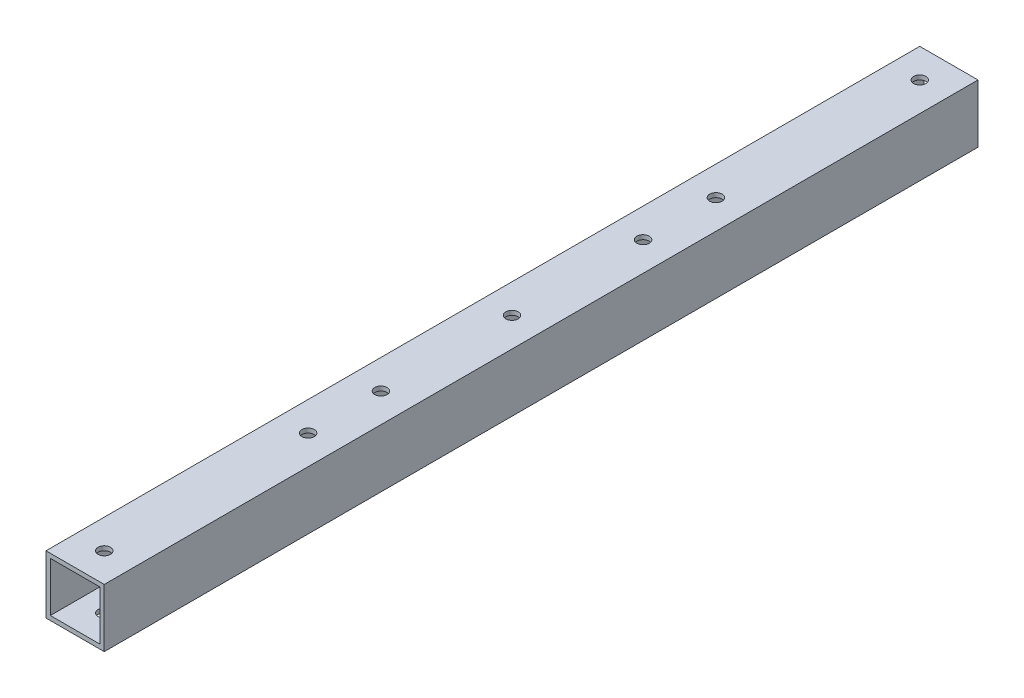
ISO-10303-21;
HEADER;
FILE_DESCRIPTION(('STEP AP214'),'2;1');
FILE_NAME('part.step','',(''),(''),'','','');
FILE_SCHEMA(('AUTOMOTIVE_DESIGN { 1 0 10303 214 1 1 1 1 }'));
ENDSEC;
DATA;
#1=APPLICATION_CONTEXT('core data for automotive mechanical design processes');
#2=APPLICATION_PROTOCOL_DEFINITION('international standard','automotive_design',2000,#1);
#3=PRODUCT_CONTEXT('',#1,'mechanical');
#4=PRODUCT('Part','Part','',(#3));
#5=PRODUCT_RELATED_PRODUCT_CATEGORY('part','',(#4));
#6=PRODUCT_DEFINITION_FORMATION('','',#4);
#7=PRODUCT_DEFINITION_CONTEXT('part definition',#1,'design');
#8=PRODUCT_DEFINITION('design','',#6,#7);
#9=PRODUCT_DEFINITION_SHAPE('','',#8);
#10=(LENGTH_UNIT() NAMED_UNIT(*) SI_UNIT(.MILLI.,.METRE.));
#11=(NAMED_UNIT(*) PLANE_ANGLE_UNIT() SI_UNIT($,.RADIAN.));
#12=(NAMED_UNIT(*) SI_UNIT($,.STERADIAN.) SOLID_ANGLE_UNIT());
#13=UNCERTAINTY_MEASURE_WITH_UNIT(LENGTH_MEASURE(1.E-05),#10,'distance_accuracy_value','');
#14=(GEOMETRIC_REPRESENTATION_CONTEXT(3) GLOBAL_UNCERTAINTY_ASSIGNED_CONTEXT((#13)) GLOBAL_UNIT_ASSIGNED_CONTEXT((#10,
#11,#12)) REPRESENTATION_CONTEXT('',''));
#15=CARTESIAN_POINT('',(0.,0.,0.));
#16=DIRECTION('',(0.,0.,1.));
#17=DIRECTION('',(1.,0.,0.));
#18=AXIS2_PLACEMENT_3D('',#15,#16,#17);
#19=CARTESIAN_POINT('',(10.,-9.99999999999999,-300.));
#20=DIRECTION('',(1.,0.,0.));
#21=DIRECTION('',(0.,0.,-1.));
#22=AXIS2_PLACEMENT_3D('',#19,#20,#21);
#23=PLANE('',#22);
#24=DIRECTION('',(0.,1.,0.));
#25=VECTOR('',#24,1.);
#26=CARTESIAN_POINT('',(10.,-9.99999999999999,0.));
#27=LINE('',#26,#25);
#28=CARTESIAN_POINT('',(10.,-9.99999999999999,0.));
#29=VERTEX_POINT('',#28);
#30=CARTESIAN_POINT('',(10.,10.,0.));
#31=VERTEX_POINT('',#30);
#32=EDGE_CURVE('E142',#29,#31,#27,.T.);
#33=ORIENTED_EDGE('',*,*,#32,.F.);
#34=DIRECTION('',(0.,0.,1.));
#35=VECTOR('',#34,1.);
#36=CARTESIAN_POINT('',(10.,-9.99999999999999,-300.));
#37=LINE('',#36,#35);
#38=CARTESIAN_POINT('',(10.,-9.99999999999999,-300.));
#39=VERTEX_POINT('',#38);
#40=EDGE_CURVE('E11',#39,#29,#37,.T.);
#41=ORIENTED_EDGE('',*,*,#40,.F.);
#42=DIRECTION('',(0.,1.,0.));
#43=VECTOR('',#42,1.);
#44=CARTESIAN_POINT('',(10.,-9.99999999999999,-300.));
#45=LINE('',#44,#43);
#46=CARTESIAN_POINT('',(10.,10.,-300.));
#47=VERTEX_POINT('',#46);
#48=EDGE_CURVE('E146',#39,#47,#45,.T.);
#49=ORIENTED_EDGE('',*,*,#48,.T.);
#50=DIRECTION('',(0.,0.,1.));
#51=VECTOR('',#50,1.);
#52=CARTESIAN_POINT('',(10.,10.,-300.));
#53=LINE('',#52,#51);
#54=EDGE_CURVE('E159',#47,#31,#53,.T.);
#55=ORIENTED_EDGE('',*,*,#54,.T.);
#56=EDGE_LOOP('',(#33,#41,#49,#55));
#57=FACE_BOUND('',#56,.T.);
#58=ADVANCED_FACE('F41',(#57),#23,.T.);
#59=CARTESIAN_POINT('',(-9.99999999999998,-9.99999999999999,-300.));
#60=DIRECTION('',(0.,-1.,0.));
#61=DIRECTION('',(0.,0.,-1.));
#62=AXIS2_PLACEMENT_3D('',#59,#60,#61);
#63=PLANE('',#62);
#64=CARTESIAN_POINT('',(0.,-9.99999999999999,-10.));
#65=DIRECTION('',(0.,1.,0.));
#66=DIRECTION('',(0.,0.,1.));
#67=AXIS2_PLACEMENT_3D('',#64,#65,#66);
#68=CIRCLE('',#67,2.125);
#69=CARTESIAN_POINT('',(0.,-9.99999999999999,-7.875));
#70=VERTEX_POINT('',#69);
#71=EDGE_CURVE('E178',#70,#70,#68,.T.);
#72=ORIENTED_EDGE('',*,*,#71,.T.);
#73=EDGE_LOOP('',(#72));
#74=FACE_BOUND('',#73,.T.);
#75=CARTESIAN_POINT('',(-7.20352289766011E-13,-9.99999999999999,-105.));
#76=DIRECTION('',(0.,1.,0.));
#77=DIRECTION('',(0.,0.,-1.));
#78=AXIS2_PLACEMENT_3D('',#75,#76,#77);
#79=CIRCLE('',#78,2.125);
#80=CARTESIAN_POINT('',(-7.20352289766011E-13,-9.99999999999999,-107.125));
#81=VERTEX_POINT('',#80);
#82=EDGE_CURVE('E239',#81,#81,#79,.T.);
#83=ORIENTED_EDGE('',*,*,#82,.T.);
#84=EDGE_LOOP('',(#83));
#85=FACE_BOUND('',#84,.T.);
#86=CARTESIAN_POINT('',(-7.20352289766011E-13,-9.99999999999999,-195.));
#87=DIRECTION('',(0.,1.,0.));
#88=DIRECTION('',(0.,0.,1.));
#89=AXIS2_PLACEMENT_3D('',#86,#87,#88);
#90=CIRCLE('',#89,2.125);
#91=CARTESIAN_POINT('',(-7.20352289766011E-13,-9.99999999999999,-192.875));
#92=VERTEX_POINT('',#91);
#93=EDGE_CURVE('E245',#92,#92,#90,.T.);
#94=ORIENTED_EDGE('',*,*,#93,.T.);
#95=EDGE_LOOP('',(#94));
#96=FACE_BOUND('',#95,.T.);
#97=CARTESIAN_POINT('',(-9.60469719688015E-13,-9.99999999999999,-290.));
#98=DIRECTION('',(0.,1.,0.));
#99=DIRECTION('',(0.,0.,1.));
#100=AXIS2_PLACEMENT_3D('',#97,#98,#99);
#101=CIRCLE('',#100,2.12499999999999);
#102=CARTESIAN_POINT('',(-9.60469719688015E-13,-9.99999999999999,-287.875));
#103=VERTEX_POINT('',#102);
#104=EDGE_CURVE('E213',#103,#103,#101,.T.);
#105=ORIENTED_EDGE('',*,*,#104,.T.);
#106=EDGE_LOOP('',(#105));
#107=FACE_BOUND('',#106,.T.);
#108=CARTESIAN_POINT('',(-7.20352289766011E-13,-9.99999999999999,-220.));
#109=DIRECTION('',(0.,1.,0.));
#110=DIRECTION('',(0.,0.,1.));
#111=AXIS2_PLACEMENT_3D('',#108,#109,#110);
#112=CIRCLE('',#111,2.125);
#113=CARTESIAN_POINT('',(-7.20352289766011E-13,-9.99999999999999,-217.875));
#114=VERTEX_POINT('',#113);
#115=EDGE_CURVE('E220',#114,#114,#112,.T.);
#116=ORIENTED_EDGE('',*,*,#115,.T.);
#117=EDGE_LOOP('',(#116));
#118=FACE_BOUND('',#117,.T.);
#119=CARTESIAN_POINT('',(-4.80234859844007E-13,-9.99999999999999,-150.));
#120=DIRECTION('',(0.,1.,0.));
#121=DIRECTION('',(0.,0.,1.));
#122=AXIS2_PLACEMENT_3D('',#119,#120,#121);
#123=CIRCLE('',#122,2.125);
#124=CARTESIAN_POINT('',(-4.80234859844007E-13,-9.99999999999999,-147.875));
#125=VERTEX_POINT('',#124);
#126=EDGE_CURVE('E226',#125,#125,#123,.T.);
#127=ORIENTED_EDGE('',*,*,#126,.T.);
#128=EDGE_LOOP('',(#127));
#129=FACE_BOUND('',#128,.T.);
#130=CARTESIAN_POINT('',(-2.40117429922004E-13,-9.99999999999999,-80.));
#131=DIRECTION('',(0.,1.,0.));
#132=DIRECTION('',(0.,0.,1.));
#133=AXIS2_PLACEMENT_3D('',#130,#131,#132);
#134=CIRCLE('',#133,2.125);
#135=CARTESIAN_POINT('',(-2.40117429922004E-13,-9.99999999999999,-77.875));
#136=VERTEX_POINT('',#135);
#137=EDGE_CURVE('E232',#136,#136,#134,.T.);
#138=ORIENTED_EDGE('',*,*,#137,.T.);
#139=EDGE_LOOP('',(#138));
#140=FACE_BOUND('',#139,.T.);
#141=DIRECTION('',(1.,0.,0.));
#142=VECTOR('',#141,1.);
#143=CARTESIAN_POINT('',(-9.99999999999998,-9.99999999999999,0.));
#144=LINE('',#143,#142);
#145=CARTESIAN_POINT('',(-9.99999999999998,-9.99999999999999,0.));
#146=VERTEX_POINT('',#145);
#147=EDGE_CURVE('E150',#146,#29,#144,.T.);
#148=ORIENTED_EDGE('',*,*,#147,.F.);
#149=DIRECTION('',(0.,0.,1.));
#150=VECTOR('',#149,1.);
#151=CARTESIAN_POINT('',(-9.99999999999998,-9.99999999999999,-300.));
#152=LINE('',#151,#150);
#153=CARTESIAN_POINT('',(-9.99999999999998,-9.99999999999999,-300.));
#154=VERTEX_POINT('',#153);
#155=EDGE_CURVE('E49',#154,#146,#152,.T.);
#156=ORIENTED_EDGE('',*,*,#155,.F.);
#157=DIRECTION('',(1.,0.,0.));
#158=VECTOR('',#157,1.);
#159=CARTESIAN_POINT('',(-9.99999999999998,-9.99999999999999,-300.));
#160=LINE('',#159,#158);
#161=EDGE_CURVE('E156',#154,#39,#160,.T.);
#162=ORIENTED_EDGE('',*,*,#161,.T.);
#163=ORIENTED_EDGE('',*,*,#40,.T.);
#164=EDGE_LOOP('',(#148,#156,#162,#163));
#165=FACE_BOUND('',#164,.T.);
#166=ADVANCED_FACE('F255',(#74,#85,#96,#107,#118,#129,#140,#165),#63,.T.);
#167=CARTESIAN_POINT('',(-9.99999999999998,-9.99999999999999,-300.));
#168=DIRECTION('',(-1.,0.,0.));
#169=DIRECTION('',(0.,0.,1.));
#170=AXIS2_PLACEMENT_3D('',#167,#168,#169);
#171=PLANE('',#170);
#172=DIRECTION('',(0.,-1.,0.));
#173=VECTOR('',#172,1.);
#174=CARTESIAN_POINT('',(-9.99999999999998,-9.99999999999999,0.));
#175=LINE('',#174,#173);
#176=CARTESIAN_POINT('',(-9.99999999999998,10.,0.));
#177=VERTEX_POINT('',#176);
#178=EDGE_CURVE('E165',#177,#146,#175,.T.);
#179=ORIENTED_EDGE('',*,*,#178,.F.);
#180=DIRECTION('',(0.,0.,1.));
#181=VECTOR('',#180,1.);
#182=CARTESIAN_POINT('',(-9.99999999999998,10.,-300.));
#183=LINE('',#182,#181);
#184=CARTESIAN_POINT('',(-9.99999999999998,10.,-300.));
#185=VERTEX_POINT('',#184);
#186=EDGE_CURVE('E171',#185,#177,#183,.T.);
#187=ORIENTED_EDGE('',*,*,#186,.F.);
#188=DIRECTION('',(0.,-1.,0.));
#189=VECTOR('',#188,1.);
#190=CARTESIAN_POINT('',(-9.99999999999998,-9.99999999999999,-300.));
#191=LINE('',#190,#189);
#192=EDGE_CURVE('E153',#185,#154,#191,.T.);
#193=ORIENTED_EDGE('',*,*,#192,.T.);
#194=ORIENTED_EDGE('',*,*,#155,.T.);
#195=EDGE_LOOP('',(#179,#187,#193,#194));
#196=FACE_BOUND('',#195,.T.);
#197=ADVANCED_FACE('F290',(#196),#171,.T.);
#198=CARTESIAN_POINT('',(-9.99999999999998,10.,-300.));
#199=DIRECTION('',(0.,1.,0.));
#200=DIRECTION('',(0.,0.,1.));
#201=AXIS2_PLACEMENT_3D('',#198,#199,#200);
#202=PLANE('',#201);
#203=CARTESIAN_POINT('',(0.,10.,-10.));
#204=DIRECTION('',(0.,1.,0.));
#205=DIRECTION('',(0.,0.,1.));
#206=AXIS2_PLACEMENT_3D('',#203,#204,#205);
#207=CIRCLE('',#206,2.125);
#208=CARTESIAN_POINT('',(0.,10.,-7.875));
#209=VERTEX_POINT('',#208);
#210=EDGE_CURVE('E238',#209,#209,#207,.T.);
#211=ORIENTED_EDGE('',*,*,#210,.F.);
#212=EDGE_LOOP('',(#211));
#213=FACE_BOUND('',#212,.T.);
#214=CARTESIAN_POINT('',(-7.20352289766011E-13,10.,-105.));
#215=DIRECTION('',(0.,1.,0.));
#216=DIRECTION('',(0.,0.,-1.));
#217=AXIS2_PLACEMENT_3D('',#214,#215,#216);
#218=CIRCLE('',#217,2.125);
#219=CARTESIAN_POINT('',(-7.20352289766011E-13,10.,-107.125));
#220=VERTEX_POINT('',#219);
#221=EDGE_CURVE('E242',#220,#220,#218,.T.);
#222=ORIENTED_EDGE('',*,*,#221,.F.);
#223=EDGE_LOOP('',(#222));
#224=FACE_BOUND('',#223,.T.);
#225=CARTESIAN_POINT('',(-7.20352289766011E-13,10.,-195.));
#226=DIRECTION('',(0.,1.,0.));
#227=DIRECTION('',(0.,0.,1.));
#228=AXIS2_PLACEMENT_3D('',#225,#226,#227);
#229=CIRCLE('',#228,2.125);
#230=CARTESIAN_POINT('',(-7.20352289766011E-13,10.,-192.875));
#231=VERTEX_POINT('',#230);
#232=EDGE_CURVE('E217',#231,#231,#229,.T.);
#233=ORIENTED_EDGE('',*,*,#232,.F.);
#234=EDGE_LOOP('',(#233));
#235=FACE_BOUND('',#234,.T.);
#236=CARTESIAN_POINT('',(-9.60469719688015E-13,10.,-290.));
#237=DIRECTION('',(0.,1.,0.));
#238=DIRECTION('',(0.,0.,1.));
#239=AXIS2_PLACEMENT_3D('',#236,#237,#238);
#240=CIRCLE('',#239,2.12499999999999);
#241=CARTESIAN_POINT('',(-9.60469719688015E-13,10.,-287.875));
#242=VERTEX_POINT('',#241);
#243=EDGE_CURVE('E216',#242,#242,#240,.T.);
#244=ORIENTED_EDGE('',*,*,#243,.F.);
#245=EDGE_LOOP('',(#244));
#246=FACE_BOUND('',#245,.T.);
#247=CARTESIAN_POINT('',(-7.20352289766011E-13,10.,-220.));
#248=DIRECTION('',(0.,1.,0.));
#249=DIRECTION('',(0.,0.,1.));
#250=AXIS2_PLACEMENT_3D('',#247,#248,#249);
#251=CIRCLE('',#250,2.125);
#252=CARTESIAN_POINT('',(-7.20352289766011E-13,10.,-217.875));
#253=VERTEX_POINT('',#252);
#254=EDGE_CURVE('E223',#253,#253,#251,.T.);
#255=ORIENTED_EDGE('',*,*,#254,.F.);
#256=EDGE_LOOP('',(#255));
#257=FACE_BOUND('',#256,.T.);
#258=CARTESIAN_POINT('',(-4.80234859844007E-13,10.,-150.));
#259=DIRECTION('',(0.,1.,0.));
#260=DIRECTION('',(0.,0.,1.));
#261=AXIS2_PLACEMENT_3D('',#258,#259,#260);
#262=CIRCLE('',#261,2.125);
#263=CARTESIAN_POINT('',(-4.80234859844007E-13,10.,-147.875));
#264=VERTEX_POINT('',#263);
#265=EDGE_CURVE('E229',#264,#264,#262,.T.);
#266=ORIENTED_EDGE('',*,*,#265,.F.);
#267=EDGE_LOOP('',(#266));
#268=FACE_BOUND('',#267,.T.);
#269=CARTESIAN_POINT('',(-2.40117429922004E-13,10.,-80.));
#270=DIRECTION('',(0.,1.,0.));
#271=DIRECTION('',(0.,0.,1.));
#272=AXIS2_PLACEMENT_3D('',#269,#270,#271);
#273=CIRCLE('',#272,2.125);
#274=CARTESIAN_POINT('',(-2.40117429922004E-13,10.,-77.875));
#275=VERTEX_POINT('',#274);
#276=EDGE_CURVE('E235',#275,#275,#273,.T.);
#277=ORIENTED_EDGE('',*,*,#276,.F.);
#278=EDGE_LOOP('',(#277));
#279=FACE_BOUND('',#278,.T.);
#280=DIRECTION('',(-1.,0.,0.));
#281=VECTOR('',#280,1.);
#282=CARTESIAN_POINT('',(-9.99999999999998,10.,0.));
#283=LINE('',#282,#281);
#284=EDGE_CURVE('E162',#31,#177,#283,.T.);
#285=ORIENTED_EDGE('',*,*,#284,.F.);
#286=ORIENTED_EDGE('',*,*,#54,.F.);
#287=DIRECTION('',(-1.,0.,0.));
#288=VECTOR('',#287,1.);
#289=CARTESIAN_POINT('',(-9.99999999999998,10.,-300.));
#290=LINE('',#289,#288);
#291=EDGE_CURVE('E149',#47,#185,#290,.T.);
#292=ORIENTED_EDGE('',*,*,#291,.T.);
#293=ORIENTED_EDGE('',*,*,#186,.T.);
#294=EDGE_LOOP('',(#285,#286,#292,#293));
#295=FACE_BOUND('',#294,.T.);
#296=ADVANCED_FACE('F304',(#213,#224,#235,#246,#257,#268,#279,#295),#202,.T.);
#297=CARTESIAN_POINT('',(0.,0.,-300.));
#298=DIRECTION('',(0.,0.,-1.));
#299=DIRECTION('',(-1.,0.,0.));
#300=AXIS2_PLACEMENT_3D('',#297,#298,#299);
#301=PLANE('',#300);
#302=DIRECTION('',(0.,-1.,0.));
#303=VECTOR('',#302,1.);
#304=CARTESIAN_POINT('',(-8.49999999999998,-8.49999999999999,-300.));
#305=LINE('',#304,#303);
#306=CARTESIAN_POINT('',(-8.49999999999998,8.50000000000002,-300.));
#307=VERTEX_POINT('',#306);
#308=CARTESIAN_POINT('',(-8.49999999999998,-8.49999999999999,-300.));
#309=VERTEX_POINT('',#308);
#310=EDGE_CURVE('E108',#307,#309,#305,.T.);
#311=ORIENTED_EDGE('',*,*,#310,.T.);
#312=DIRECTION('',(1.,0.,0.));
#313=VECTOR('',#312,1.);
#314=CARTESIAN_POINT('',(-8.49999999999998,-8.49999999999999,-300.));
#315=LINE('',#314,#313);
#316=CARTESIAN_POINT('',(8.50000000000002,-8.49999999999999,-300.));
#317=VERTEX_POINT('',#316);
#318=EDGE_CURVE('E117',#309,#317,#315,.T.);
#319=ORIENTED_EDGE('',*,*,#318,.T.);
#320=DIRECTION('',(0.,1.,0.));
#321=VECTOR('',#320,1.);
#322=CARTESIAN_POINT('',(8.50000000000002,-8.49999999999999,-300.));
#323=LINE('',#322,#321);
#324=CARTESIAN_POINT('',(8.50000000000002,8.50000000000002,-300.));
#325=VERTEX_POINT('',#324);
#326=EDGE_CURVE('E57',#317,#325,#323,.T.);
#327=ORIENTED_EDGE('',*,*,#326,.T.);
#328=DIRECTION('',(-1.,0.,0.));
#329=VECTOR('',#328,1.);
#330=CARTESIAN_POINT('',(-8.49999999999998,8.50000000000002,-300.));
#331=LINE('',#330,#329);
#332=EDGE_CURVE('E114',#325,#307,#331,.T.);
#333=ORIENTED_EDGE('',*,*,#332,.T.);
#334=EDGE_LOOP('',(#311,#319,#327,#333));
#335=FACE_BOUND('',#334,.T.);
#336=ORIENTED_EDGE('',*,*,#48,.F.);
#337=ORIENTED_EDGE('',*,*,#161,.F.);
#338=ORIENTED_EDGE('',*,*,#192,.F.);
#339=ORIENTED_EDGE('',*,*,#291,.F.);
#340=EDGE_LOOP('',(#336,#337,#338,#339));
#341=FACE_BOUND('',#340,.T.);
#342=ADVANCED_FACE('F121',(#335,#341),#301,.T.);
#343=CARTESIAN_POINT('',(0.,0.,0.));
#344=DIRECTION('',(0.,0.,-1.));
#345=DIRECTION('',(-1.,0.,0.));
#346=AXIS2_PLACEMENT_3D('',#343,#344,#345);
#347=PLANE('',#346);
#348=DIRECTION('',(1.,0.,0.));
#349=VECTOR('',#348,1.);
#350=CARTESIAN_POINT('',(-8.49999999999998,-8.49999999999999,0.));
#351=LINE('',#350,#349);
#352=CARTESIAN_POINT('',(-8.49999999999998,-8.49999999999999,0.));
#353=VERTEX_POINT('',#352);
#354=CARTESIAN_POINT('',(8.50000000000002,-8.49999999999999,0.));
#355=VERTEX_POINT('',#354);
#356=EDGE_CURVE('E136',#353,#355,#351,.T.);
#357=ORIENTED_EDGE('',*,*,#356,.F.);
#358=DIRECTION('',(0.,-1.,0.));
#359=VECTOR('',#358,1.);
#360=CARTESIAN_POINT('',(-8.49999999999998,-8.49999999999999,0.));
#361=LINE('',#360,#359);
#362=CARTESIAN_POINT('',(-8.49999999999998,8.50000000000002,0.));
#363=VERTEX_POINT('',#362);
#364=EDGE_CURVE('E65',#363,#353,#361,.T.);
#365=ORIENTED_EDGE('',*,*,#364,.F.);
#366=DIRECTION('',(-1.,0.,0.));
#367=VECTOR('',#366,1.);
#368=CARTESIAN_POINT('',(-8.49999999999998,8.50000000000002,0.));
#369=LINE('',#368,#367);
#370=CARTESIAN_POINT('',(8.50000000000002,8.50000000000002,0.));
#371=VERTEX_POINT('',#370);
#372=EDGE_CURVE('E124',#371,#363,#369,.T.);
#373=ORIENTED_EDGE('',*,*,#372,.F.);
#374=DIRECTION('',(0.,1.,0.));
#375=VECTOR('',#374,1.);
#376=CARTESIAN_POINT('',(8.50000000000002,-8.49999999999999,0.));
#377=LINE('',#376,#375);
#378=EDGE_CURVE('E127',#355,#371,#377,.T.);
#379=ORIENTED_EDGE('',*,*,#378,.F.);
#380=EDGE_LOOP('',(#357,#365,#373,#379));
#381=FACE_BOUND('',#380,.T.);
#382=ORIENTED_EDGE('',*,*,#32,.T.);
#383=ORIENTED_EDGE('',*,*,#284,.T.);
#384=ORIENTED_EDGE('',*,*,#178,.T.);
#385=ORIENTED_EDGE('',*,*,#147,.T.);
#386=EDGE_LOOP('',(#382,#383,#384,#385));
#387=FACE_BOUND('',#386,.T.);
#388=ADVANCED_FACE('F297',(#381,#387),#347,.F.);
#389=CARTESIAN_POINT('',(-8.49999999999998,-8.49999999999999,-300.));
#390=DIRECTION('',(-1.,0.,0.));
#391=DIRECTION('',(0.,0.,1.));
#392=AXIS2_PLACEMENT_3D('',#389,#390,#391);
#393=PLANE('',#392);
#394=ORIENTED_EDGE('',*,*,#364,.T.);
#395=DIRECTION('',(0.,0.,1.));
#396=VECTOR('',#395,1.);
#397=CARTESIAN_POINT('',(-8.49999999999998,-8.49999999999999,-300.));
#398=LINE('',#397,#396);
#399=EDGE_CURVE('E104',#309,#353,#398,.T.);
#400=ORIENTED_EDGE('',*,*,#399,.F.);
#401=ORIENTED_EDGE('',*,*,#310,.F.);
#402=DIRECTION('',(0.,0.,1.));
#403=VECTOR('',#402,1.);
#404=CARTESIAN_POINT('',(-8.49999999999998,8.50000000000002,-300.));
#405=LINE('',#404,#403);
#406=EDGE_CURVE('E140',#307,#363,#405,.T.);
#407=ORIENTED_EDGE('',*,*,#406,.T.);
#408=EDGE_LOOP('',(#394,#400,#401,#407));
#409=FACE_BOUND('',#408,.T.);
#410=ADVANCED_FACE('F106',(#409),#393,.F.);
#411=CARTESIAN_POINT('',(-8.49999999999998,8.50000000000002,-300.));
#412=DIRECTION('',(0.,1.,0.));
#413=DIRECTION('',(0.,0.,1.));
#414=AXIS2_PLACEMENT_3D('',#411,#412,#413);
#415=PLANE('',#414);
#416=CARTESIAN_POINT('',(0.,8.50000000000002,-10.));
#417=DIRECTION('',(0.,1.,0.));
#418=DIRECTION('',(0.,0.,1.));
#419=AXIS2_PLACEMENT_3D('',#416,#417,#418);
#420=CIRCLE('',#419,2.125);
#421=CARTESIAN_POINT('',(0.,8.50000000000002,-7.875));
#422=VERTEX_POINT('',#421);
#423=EDGE_CURVE('E130',#422,#422,#420,.T.);
#424=ORIENTED_EDGE('',*,*,#423,.T.);
#425=EDGE_LOOP('',(#424));
#426=FACE_BOUND('',#425,.T.);
#427=CARTESIAN_POINT('',(-7.20352289766011E-13,8.50000000000002,-105.));
#428=DIRECTION('',(0.,1.,0.));
#429=DIRECTION('',(0.,0.,1.));
#430=AXIS2_PLACEMENT_3D('',#427,#428,#429);
#431=CIRCLE('',#430,2.125);
#432=CARTESIAN_POINT('',(-7.20352289766011E-13,8.50000000000002,-102.875));
#433=VERTEX_POINT('',#432);
#434=EDGE_CURVE('E196',#433,#433,#431,.T.);
#435=ORIENTED_EDGE('',*,*,#434,.T.);
#436=EDGE_LOOP('',(#435));
#437=FACE_BOUND('',#436,.T.);
#438=CARTESIAN_POINT('',(-7.20352289766011E-13,8.50000000000002,-195.));
#439=DIRECTION('',(0.,1.,0.));
#440=DIRECTION('',(0.,0.,1.));
#441=AXIS2_PLACEMENT_3D('',#438,#439,#440);
#442=CIRCLE('',#441,2.125);
#443=CARTESIAN_POINT('',(-7.20352289766011E-13,8.50000000000002,-192.875));
#444=VERTEX_POINT('',#443);
#445=EDGE_CURVE('E193',#444,#444,#442,.T.);
#446=ORIENTED_EDGE('',*,*,#445,.T.);
#447=EDGE_LOOP('',(#446));
#448=FACE_BOUND('',#447,.T.);
#449=CARTESIAN_POINT('',(-9.60469719688015E-13,8.50000000000002,-290.));
#450=DIRECTION('',(0.,1.,0.));
#451=DIRECTION('',(0.,0.,1.));
#452=AXIS2_PLACEMENT_3D('',#449,#450,#451);
#453=CIRCLE('',#452,2.12499999999999);
#454=CARTESIAN_POINT('',(-9.60469719688015E-13,8.50000000000002,-287.875));
#455=VERTEX_POINT('',#454);
#456=EDGE_CURVE('E190',#455,#455,#453,.T.);
#457=ORIENTED_EDGE('',*,*,#456,.T.);
#458=EDGE_LOOP('',(#457));
#459=FACE_BOUND('',#458,.T.);
#460=CARTESIAN_POINT('',(-7.20352289766011E-13,8.50000000000002,-220.));
#461=DIRECTION('',(0.,1.,0.));
#462=DIRECTION('',(0.,0.,1.));
#463=AXIS2_PLACEMENT_3D('',#460,#461,#462);
#464=CIRCLE('',#463,2.125);
#465=CARTESIAN_POINT('',(-7.20352289766011E-13,8.50000000000002,-217.875));
#466=VERTEX_POINT('',#465);
#467=EDGE_CURVE('E186',#466,#466,#464,.T.);
#468=ORIENTED_EDGE('',*,*,#467,.T.);
#469=EDGE_LOOP('',(#468));
#470=FACE_BOUND('',#469,.T.);
#471=CARTESIAN_POINT('',(-4.80234859844007E-13,8.50000000000002,-150.));
#472=DIRECTION('',(0.,1.,0.));
#473=DIRECTION('',(0.,0.,1.));
#474=AXIS2_PLACEMENT_3D('',#471,#472,#473);
#475=CIRCLE('',#474,2.125);
#476=CARTESIAN_POINT('',(-4.80234859844007E-13,8.50000000000002,-147.875));
#477=VERTEX_POINT('',#476);
#478=EDGE_CURVE('E182',#477,#477,#475,.T.);
#479=ORIENTED_EDGE('',*,*,#478,.T.);
#480=EDGE_LOOP('',(#479));
#481=FACE_BOUND('',#480,.T.);
#482=CARTESIAN_POINT('',(-2.40117429922004E-13,8.50000000000002,-80.));
#483=DIRECTION('',(0.,1.,0.));
#484=DIRECTION('',(0.,0.,1.));
#485=AXIS2_PLACEMENT_3D('',#482,#483,#484);
#486=CIRCLE('',#485,2.125);
#487=CARTESIAN_POINT('',(-2.40117429922004E-13,8.50000000000002,-77.875));
#488=VERTEX_POINT('',#487);
#489=EDGE_CURVE('E177',#488,#488,#486,.T.);
#490=ORIENTED_EDGE('',*,*,#489,.T.);
#491=EDGE_LOOP('',(#490));
#492=FACE_BOUND('',#491,.T.);
#493=ORIENTED_EDGE('',*,*,#372,.T.);
#494=ORIENTED_EDGE('',*,*,#406,.F.);
#495=ORIENTED_EDGE('',*,*,#332,.F.);
#496=DIRECTION('',(0.,0.,1.));
#497=VECTOR('',#496,1.);
#498=CARTESIAN_POINT('',(8.50000000000002,8.50000000000002,-300.));
#499=LINE('',#498,#497);
#500=EDGE_CURVE('E143',#325,#371,#499,.T.);
#501=ORIENTED_EDGE('',*,*,#500,.T.);
#502=EDGE_LOOP('',(#493,#494,#495,#501));
#503=FACE_BOUND('',#502,.T.);
#504=ADVANCED_FACE('F271',(#426,#437,#448,#459,#470,#481,#492,#503),#415,.F.);
#505=CARTESIAN_POINT('',(8.50000000000002,-8.49999999999999,-300.));
#506=DIRECTION('',(1.,0.,0.));
#507=DIRECTION('',(0.,0.,-1.));
#508=AXIS2_PLACEMENT_3D('',#505,#506,#507);
#509=PLANE('',#508);
#510=ORIENTED_EDGE('',*,*,#378,.T.);
#511=ORIENTED_EDGE('',*,*,#500,.F.);
#512=ORIENTED_EDGE('',*,*,#326,.F.);
#513=DIRECTION('',(0.,0.,1.));
#514=VECTOR('',#513,1.);
#515=CARTESIAN_POINT('',(8.50000000000002,-8.49999999999999,-300.));
#516=LINE('',#515,#514);
#517=EDGE_CURVE('E113',#317,#355,#516,.T.);
#518=ORIENTED_EDGE('',*,*,#517,.T.);
#519=EDGE_LOOP('',(#510,#511,#512,#518));
#520=FACE_BOUND('',#519,.T.);
#521=ADVANCED_FACE('F322',(#520),#509,.F.);
#522=CARTESIAN_POINT('',(-8.49999999999998,-8.49999999999999,-300.));
#523=DIRECTION('',(0.,-1.,0.));
#524=DIRECTION('',(0.,0.,-1.));
#525=AXIS2_PLACEMENT_3D('',#522,#523,#524);
#526=PLANE('',#525);
#527=CARTESIAN_POINT('',(0.,-8.49999999999999,-10.));
#528=DIRECTION('',(0.,-1.,0.));
#529=DIRECTION('',(0.,0.,-1.));
#530=AXIS2_PLACEMENT_3D('',#527,#528,#529);
#531=CIRCLE('',#530,2.125);
#532=CARTESIAN_POINT('',(0.,-8.49999999999999,-12.125));
#533=VERTEX_POINT('',#532);
#534=EDGE_CURVE('E44',#533,#533,#531,.T.);
#535=ORIENTED_EDGE('',*,*,#534,.T.);
#536=EDGE_LOOP('',(#535));
#537=FACE_BOUND('',#536,.T.);
#538=CARTESIAN_POINT('',(-7.20352289766011E-13,-8.49999999999999,-105.));
#539=DIRECTION('',(0.,-1.,0.));
#540=DIRECTION('',(0.,0.,-1.));
#541=AXIS2_PLACEMENT_3D('',#538,#539,#540);
#542=CIRCLE('',#541,2.125);
#543=CARTESIAN_POINT('',(-7.20352289766011E-13,-8.49999999999999,-107.125));
#544=VERTEX_POINT('',#543);
#545=EDGE_CURVE('E194',#544,#544,#542,.T.);
#546=ORIENTED_EDGE('',*,*,#545,.T.);
#547=EDGE_LOOP('',(#546));
#548=FACE_BOUND('',#547,.T.);
#549=CARTESIAN_POINT('',(-7.20352289766011E-13,-8.49999999999999,-195.));
#550=DIRECTION('',(0.,-1.,0.));
#551=DIRECTION('',(0.,0.,-1.));
#552=AXIS2_PLACEMENT_3D('',#549,#550,#551);
#553=CIRCLE('',#552,2.125);
#554=CARTESIAN_POINT('',(-7.20352289766011E-13,-8.49999999999999,-197.125));
#555=VERTEX_POINT('',#554);
#556=EDGE_CURVE('E191',#555,#555,#553,.T.);
#557=ORIENTED_EDGE('',*,*,#556,.T.);
#558=EDGE_LOOP('',(#557));
#559=FACE_BOUND('',#558,.T.);
#560=CARTESIAN_POINT('',(-9.60469719688015E-13,-8.49999999999999,-290.));
#561=DIRECTION('',(0.,-1.,0.));
#562=DIRECTION('',(0.,0.,-1.));
#563=AXIS2_PLACEMENT_3D('',#560,#561,#562);
#564=CIRCLE('',#563,2.12499999999999);
#565=CARTESIAN_POINT('',(-9.60469719688015E-13,-8.49999999999999,-292.125));
#566=VERTEX_POINT('',#565);
#567=EDGE_CURVE('E187',#566,#566,#564,.T.);
#568=ORIENTED_EDGE('',*,*,#567,.T.);
#569=EDGE_LOOP('',(#568));
#570=FACE_BOUND('',#569,.T.);
#571=CARTESIAN_POINT('',(-7.20352289766011E-13,-8.49999999999999,-220.));
#572=DIRECTION('',(0.,-1.,0.));
#573=DIRECTION('',(0.,0.,-1.));
#574=AXIS2_PLACEMENT_3D('',#571,#572,#573);
#575=CIRCLE('',#574,2.125);
#576=CARTESIAN_POINT('',(-7.20352289766011E-13,-8.49999999999999,-222.125));
#577=VERTEX_POINT('',#576);
#578=EDGE_CURVE('E183',#577,#577,#575,.T.);
#579=ORIENTED_EDGE('',*,*,#578,.T.);
#580=EDGE_LOOP('',(#579));
#581=FACE_BOUND('',#580,.T.);
#582=CARTESIAN_POINT('',(-4.80234859844007E-13,-8.49999999999999,-150.));
#583=DIRECTION('',(0.,-1.,0.));
#584=DIRECTION('',(0.,0.,-1.));
#585=AXIS2_PLACEMENT_3D('',#582,#583,#584);
#586=CIRCLE('',#585,2.125);
#587=CARTESIAN_POINT('',(-4.80234859844007E-13,-8.49999999999999,-152.125));
#588=VERTEX_POINT('',#587);
#589=EDGE_CURVE('E179',#588,#588,#586,.T.);
#590=ORIENTED_EDGE('',*,*,#589,.T.);
#591=EDGE_LOOP('',(#590));
#592=FACE_BOUND('',#591,.T.);
#593=CARTESIAN_POINT('',(-2.40117429922004E-13,-8.49999999999999,-80.));
#594=DIRECTION('',(0.,-1.,0.));
#595=DIRECTION('',(0.,0.,-1.));
#596=AXIS2_PLACEMENT_3D('',#593,#594,#595);
#597=CIRCLE('',#596,2.125);
#598=CARTESIAN_POINT('',(-2.40117429922004E-13,-8.49999999999999,-82.125));
#599=VERTEX_POINT('',#598);
#600=EDGE_CURVE('E174',#599,#599,#597,.T.);
#601=ORIENTED_EDGE('',*,*,#600,.T.);
#602=EDGE_LOOP('',(#601));
#603=FACE_BOUND('',#602,.T.);
#604=ORIENTED_EDGE('',*,*,#356,.T.);
#605=ORIENTED_EDGE('',*,*,#517,.F.);
#606=ORIENTED_EDGE('',*,*,#318,.F.);
#607=ORIENTED_EDGE('',*,*,#399,.T.);
#608=EDGE_LOOP('',(#604,#605,#606,#607));
#609=FACE_BOUND('',#608,.T.);
#610=ADVANCED_FACE('F118',(#537,#548,#559,#570,#581,#592,#603,#609),#526,.F.);
#611=CARTESIAN_POINT('',(-2.40117429922004E-13,-9.99999999999999,-80.));
#612=DIRECTION('',(0.,1.,0.));
#613=DIRECTION('',(0.,0.,1.));
#614=AXIS2_PLACEMENT_3D('',#611,#612,#613);
#615=CYLINDRICAL_SURFACE('',#614,2.125);
#616=ORIENTED_EDGE('',*,*,#137,.F.);
#617=EDGE_LOOP('',(#616));
#618=FACE_BOUND('',#617,.T.);
#619=ORIENTED_EDGE('',*,*,#600,.F.);
#620=EDGE_LOOP('',(#619));
#621=FACE_BOUND('',#620,.T.);
#622=ADVANCED_FACE('F321',(#618,#621),#615,.F.);
#623=CARTESIAN_POINT('',(-4.80234859844007E-13,-9.99999999999999,-150.));
#624=DIRECTION('',(0.,1.,0.));
#625=DIRECTION('',(0.,0.,1.));
#626=AXIS2_PLACEMENT_3D('',#623,#624,#625);
#627=CYLINDRICAL_SURFACE('',#626,2.125);
#628=ORIENTED_EDGE('',*,*,#126,.F.);
#629=EDGE_LOOP('',(#628));
#630=FACE_BOUND('',#629,.T.);
#631=ORIENTED_EDGE('',*,*,#589,.F.);
#632=EDGE_LOOP('',(#631));
#633=FACE_BOUND('',#632,.T.);
#634=ADVANCED_FACE('F341',(#630,#633),#627,.F.);
#635=CARTESIAN_POINT('',(-7.20352289766011E-13,-9.99999999999999,-220.));
#636=DIRECTION('',(0.,1.,0.));
#637=DIRECTION('',(0.,0.,1.));
#638=AXIS2_PLACEMENT_3D('',#635,#636,#637);
#639=CYLINDRICAL_SURFACE('',#638,2.125);
#640=ORIENTED_EDGE('',*,*,#115,.F.);
#641=EDGE_LOOP('',(#640));
#642=FACE_BOUND('',#641,.T.);
#643=ORIENTED_EDGE('',*,*,#578,.F.);
#644=EDGE_LOOP('',(#643));
#645=FACE_BOUND('',#644,.T.);
#646=ADVANCED_FACE('F337',(#642,#645),#639,.F.);
#647=CARTESIAN_POINT('',(-9.60469719688015E-13,-9.99999999999999,-290.));
#648=DIRECTION('',(0.,1.,0.));
#649=DIRECTION('',(0.,0.,1.));
#650=AXIS2_PLACEMENT_3D('',#647,#648,#649);
#651=CYLINDRICAL_SURFACE('',#650,2.12499999999999);
#652=ORIENTED_EDGE('',*,*,#104,.F.);
#653=EDGE_LOOP('',(#652));
#654=FACE_BOUND('',#653,.T.);
#655=ORIENTED_EDGE('',*,*,#567,.F.);
#656=EDGE_LOOP('',(#655));
#657=FACE_BOUND('',#656,.T.);
#658=ADVANCED_FACE('F332',(#654,#657),#651,.F.);
#659=CARTESIAN_POINT('',(-7.20352289766011E-13,-9.99999999999999,-195.));
#660=DIRECTION('',(0.,1.,0.));
#661=DIRECTION('',(0.,0.,1.));
#662=AXIS2_PLACEMENT_3D('',#659,#660,#661);
#663=CYLINDRICAL_SURFACE('',#662,2.125);
#664=ORIENTED_EDGE('',*,*,#93,.F.);
#665=EDGE_LOOP('',(#664));
#666=FACE_BOUND('',#665,.T.);
#667=ORIENTED_EDGE('',*,*,#556,.F.);
#668=EDGE_LOOP('',(#667));
#669=FACE_BOUND('',#668,.T.);
#670=ADVANCED_FACE('F346',(#666,#669),#663,.F.);
#671=CARTESIAN_POINT('',(-7.20352289766011E-13,-9.99999999999999,-105.));
#672=DIRECTION('',(0.,1.,0.));
#673=DIRECTION('',(0.,0.,1.));
#674=AXIS2_PLACEMENT_3D('',#671,#672,#673);
#675=CYLINDRICAL_SURFACE('',#674,2.125);
#676=ORIENTED_EDGE('',*,*,#82,.F.);
#677=EDGE_LOOP('',(#676));
#678=FACE_BOUND('',#677,.T.);
#679=ORIENTED_EDGE('',*,*,#545,.F.);
#680=EDGE_LOOP('',(#679));
#681=FACE_BOUND('',#680,.T.);
#682=ADVANCED_FACE('F262',(#678,#681),#675,.F.);
#683=CARTESIAN_POINT('',(0.,-9.99999999999999,-10.));
#684=DIRECTION('',(0.,1.,0.));
#685=DIRECTION('',(0.,0.,1.));
#686=AXIS2_PLACEMENT_3D('',#683,#684,#685);
#687=CYLINDRICAL_SURFACE('',#686,2.125);
#688=ORIENTED_EDGE('',*,*,#71,.F.);
#689=EDGE_LOOP('',(#688));
#690=FACE_BOUND('',#689,.T.);
#691=ORIENTED_EDGE('',*,*,#534,.F.);
#692=EDGE_LOOP('',(#691));
#693=FACE_BOUND('',#692,.T.);
#694=ADVANCED_FACE('F258',(#690,#693),#687,.F.);
#695=ORIENTED_EDGE('',*,*,#276,.T.);
#696=EDGE_LOOP('',(#695));
#697=FACE_BOUND('',#696,.T.);
#698=ORIENTED_EDGE('',*,*,#489,.F.);
#699=EDGE_LOOP('',(#698));
#700=FACE_BOUND('',#699,.T.);
#701=ADVANCED_FACE('F261',(#697,#700),#615,.F.);
#702=ORIENTED_EDGE('',*,*,#265,.T.);
#703=EDGE_LOOP('',(#702));
#704=FACE_BOUND('',#703,.T.);
#705=ORIENTED_EDGE('',*,*,#478,.F.);
#706=EDGE_LOOP('',(#705));
#707=FACE_BOUND('',#706,.T.);
#708=ADVANCED_FACE('F335',(#704,#707),#627,.F.);
#709=ORIENTED_EDGE('',*,*,#254,.T.);
#710=EDGE_LOOP('',(#709));
#711=FACE_BOUND('',#710,.T.);
#712=ORIENTED_EDGE('',*,*,#467,.F.);
#713=EDGE_LOOP('',(#712));
#714=FACE_BOUND('',#713,.T.);
#715=ADVANCED_FACE('F330',(#711,#714),#639,.F.);
#716=ORIENTED_EDGE('',*,*,#243,.T.);
#717=EDGE_LOOP('',(#716));
#718=FACE_BOUND('',#717,.T.);
#719=ORIENTED_EDGE('',*,*,#456,.F.);
#720=EDGE_LOOP('',(#719));
#721=FACE_BOUND('',#720,.T.);
#722=ADVANCED_FACE('F327',(#718,#721),#651,.F.);
#723=ORIENTED_EDGE('',*,*,#232,.T.);
#724=EDGE_LOOP('',(#723));
#725=FACE_BOUND('',#724,.T.);
#726=ORIENTED_EDGE('',*,*,#445,.F.);
#727=EDGE_LOOP('',(#726));
#728=FACE_BOUND('',#727,.T.);
#729=ADVANCED_FACE('F280',(#725,#728),#663,.F.);
#730=ORIENTED_EDGE('',*,*,#221,.T.);
#731=EDGE_LOOP('',(#730));
#732=FACE_BOUND('',#731,.T.);
#733=ORIENTED_EDGE('',*,*,#434,.F.);
#734=EDGE_LOOP('',(#733));
#735=FACE_BOUND('',#734,.T.);
#736=ADVANCED_FACE('F275',(#732,#735),#675,.F.);
#737=ORIENTED_EDGE('',*,*,#210,.T.);
#738=EDGE_LOOP('',(#737));
#739=FACE_BOUND('',#738,.T.);
#740=ORIENTED_EDGE('',*,*,#423,.F.);
#741=EDGE_LOOP('',(#740));
#742=FACE_BOUND('',#741,.T.);
#743=ADVANCED_FACE('F264',(#739,#742),#687,.F.);
#744=CLOSED_SHELL('',(#58,#166,#197,#296,#342,#388,#410,#504,#521,#610,#622,#634,#646,#658,#670,
#682,#694,#701,#708,#715,#722,#729,#736,#743));
#745=MANIFOLD_SOLID_BREP('B2',#744);
#746=ADVANCED_BREP_SHAPE_REPRESENTATION('',(#18,#745),#14);
#747=SHAPE_DEFINITION_REPRESENTATION(#9,#746);
ENDSEC;
END-ISO-10303-21;
